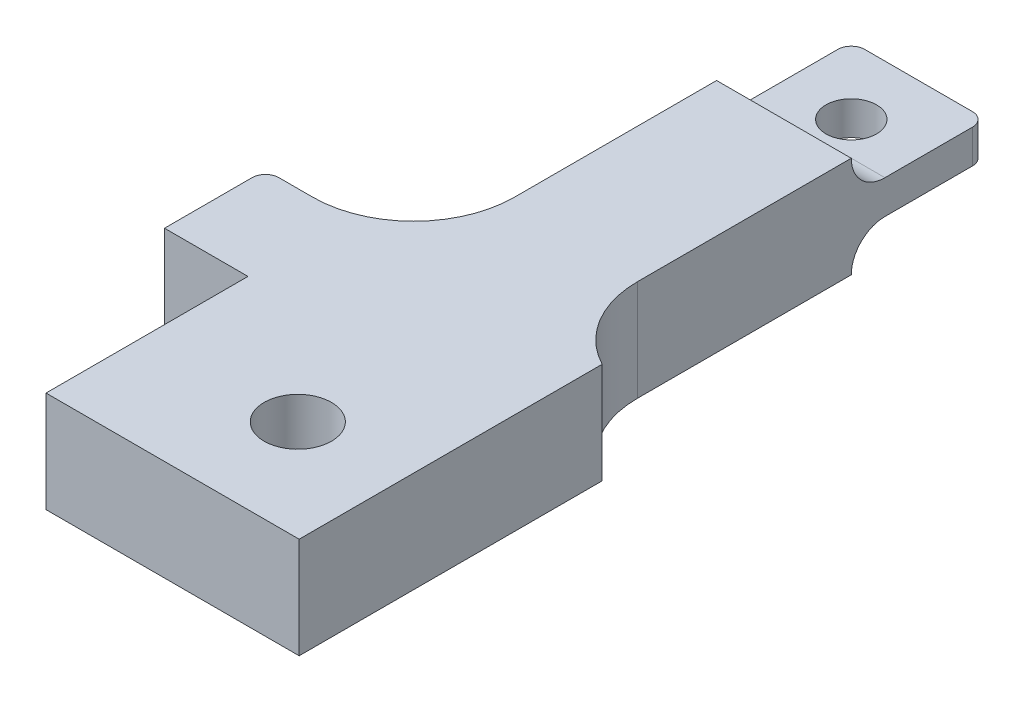
ISO-10303-21;
HEADER;
FILE_DESCRIPTION(('STEP AP214'),'2;1');
FILE_NAME('part.step','',(''),(''),'','','');
FILE_SCHEMA(('AUTOMOTIVE_DESIGN { 1 0 10303 214 1 1 1 1 }'));
ENDSEC;
DATA;
#1=APPLICATION_CONTEXT('core data for automotive mechanical design processes');
#2=APPLICATION_PROTOCOL_DEFINITION('international standard','automotive_design',2000,#1);
#3=PRODUCT_CONTEXT('',#1,'mechanical');
#4=PRODUCT('Part','Part','',(#3));
#5=PRODUCT_RELATED_PRODUCT_CATEGORY('part','',(#4));
#6=PRODUCT_DEFINITION_FORMATION('','',#4);
#7=PRODUCT_DEFINITION_CONTEXT('part definition',#1,'design');
#8=PRODUCT_DEFINITION('design','',#6,#7);
#9=PRODUCT_DEFINITION_SHAPE('','',#8);
#10=(LENGTH_UNIT() NAMED_UNIT(*) SI_UNIT(.MILLI.,.METRE.));
#11=(NAMED_UNIT(*) PLANE_ANGLE_UNIT() SI_UNIT($,.RADIAN.));
#12=(NAMED_UNIT(*) SI_UNIT($,.STERADIAN.) SOLID_ANGLE_UNIT());
#13=UNCERTAINTY_MEASURE_WITH_UNIT(LENGTH_MEASURE(1.E-05),#10,'distance_accuracy_value','');
#14=(GEOMETRIC_REPRESENTATION_CONTEXT(3) GLOBAL_UNCERTAINTY_ASSIGNED_CONTEXT((#13)) GLOBAL_UNIT_ASSIGNED_CONTEXT((#10,
#11,#12)) REPRESENTATION_CONTEXT('',''));
#15=CARTESIAN_POINT('',(0.,0.,0.));
#16=DIRECTION('',(0.,0.,1.));
#17=DIRECTION('',(1.,0.,0.));
#18=AXIS2_PLACEMENT_3D('',#15,#16,#17);
#19=CARTESIAN_POINT('',(6.096,9.525,-69.85));
#20=DIRECTION('',(0.,0.,1.));
#21=DIRECTION('',(1.,0.,0.));
#22=AXIS2_PLACEMENT_3D('',#19,#20,#21);
#23=PLANE('',#22);
#24=DIRECTION('',(0.,-1.,0.));
#25=VECTOR('',#24,1.);
#26=CARTESIAN_POINT('',(17.526,9.525,-69.85));
#27=LINE('',#26,#25);
#28=CARTESIAN_POINT('',(17.526,6.35,-69.85));
#29=VERTEX_POINT('',#28);
#30=CARTESIAN_POINT('',(17.526,3.175,-69.85));
#31=VERTEX_POINT('',#30);
#32=EDGE_CURVE('E292',#29,#31,#27,.T.);
#33=ORIENTED_EDGE('',*,*,#32,.T.);
#34=DIRECTION('',(1.,0.,0.));
#35=VECTOR('',#34,1.);
#36=CARTESIAN_POINT('',(6.096,3.175,-69.85));
#37=LINE('',#36,#35);
#38=CARTESIAN_POINT('',(7.366,3.175,-69.85));
#39=VERTEX_POINT('',#38);
#40=EDGE_CURVE('E192',#39,#31,#37,.T.);
#41=ORIENTED_EDGE('',*,*,#40,.F.);
#42=DIRECTION('',(0.,-1.,0.));
#43=VECTOR('',#42,1.);
#44=CARTESIAN_POINT('',(7.366,9.525,-69.85));
#45=LINE('',#44,#43);
#46=CARTESIAN_POINT('',(7.366,6.35,-69.85));
#47=VERTEX_POINT('',#46);
#48=EDGE_CURVE('E290',#39,#47,#45,.F.);
#49=ORIENTED_EDGE('',*,*,#48,.T.);
#50=DIRECTION('',(-1.,0.,0.));
#51=VECTOR('',#50,1.);
#52=CARTESIAN_POINT('',(6.096,6.35,-69.85));
#53=LINE('',#52,#51);
#54=EDGE_CURVE('E210',#29,#47,#53,.T.);
#55=ORIENTED_EDGE('',*,*,#54,.F.);
#56=EDGE_LOOP('',(#33,#41,#49,#55));
#57=FACE_BOUND('',#56,.T.);
#58=ADVANCED_FACE('F39',(#57),#23,.F.);
#59=CARTESIAN_POINT('',(12.446,9.525,-63.5));
#60=DIRECTION('',(0.,1.,0.));
#61=DIRECTION('',(0.,0.,1.));
#62=AXIS2_PLACEMENT_3D('',#59,#60,#61);
#63=CYLINDRICAL_SURFACE('',#62,2.38125);
#64=CARTESIAN_POINT('',(12.446,3.175,-63.5));
#65=DIRECTION('',(0.,1.,0.));
#66=DIRECTION('',(0.,0.,1.));
#67=AXIS2_PLACEMENT_3D('',#64,#65,#66);
#68=CIRCLE('',#67,2.38125);
#69=CARTESIAN_POINT('',(12.446,3.175,-61.11875));
#70=VERTEX_POINT('',#69);
#71=EDGE_CURVE('E202',#70,#70,#68,.F.);
#72=ORIENTED_EDGE('',*,*,#71,.T.);
#73=EDGE_LOOP('',(#72));
#74=FACE_BOUND('',#73,.T.);
#75=CARTESIAN_POINT('',(12.446,6.35,-63.5));
#76=DIRECTION('',(0.,1.,0.));
#77=DIRECTION('',(0.,0.,1.));
#78=AXIS2_PLACEMENT_3D('',#75,#76,#77);
#79=CIRCLE('',#78,2.38125);
#80=CARTESIAN_POINT('',(12.446,6.35,-61.11875));
#81=VERTEX_POINT('',#80);
#82=EDGE_CURVE('E217',#81,#81,#79,.F.);
#83=ORIENTED_EDGE('',*,*,#82,.F.);
#84=EDGE_LOOP('',(#83));
#85=FACE_BOUND('',#84,.T.);
#86=ADVANCED_FACE('F345',(#74,#85),#63,.F.);
#87=CARTESIAN_POINT('',(17.526,9.525,-68.58));
#88=DIRECTION('',(0.,-1.,0.));
#89=DIRECTION('',(0.,0.,-1.));
#90=AXIS2_PLACEMENT_3D('',#87,#88,#89);
#91=CYLINDRICAL_SURFACE('',#90,1.27);
#92=CARTESIAN_POINT('',(17.526,3.175,-68.58));
#93=DIRECTION('',(0.,1.,0.));
#94=DIRECTION('',(0.,0.,1.));
#95=AXIS2_PLACEMENT_3D('',#92,#93,#94);
#96=CIRCLE('',#95,1.27);
#97=CARTESIAN_POINT('',(18.796,3.175,-68.58));
#98=VERTEX_POINT('',#97);
#99=EDGE_CURVE('E200',#31,#98,#96,.F.);
#100=ORIENTED_EDGE('',*,*,#99,.F.);
#101=ORIENTED_EDGE('',*,*,#32,.F.);
#102=CARTESIAN_POINT('',(17.526,6.35,-68.58));
#103=DIRECTION('',(0.,1.,0.));
#104=DIRECTION('',(0.,0.,1.));
#105=AXIS2_PLACEMENT_3D('',#102,#103,#104);
#106=CIRCLE('',#105,1.27);
#107=CARTESIAN_POINT('',(18.796,6.35,-68.58));
#108=VERTEX_POINT('',#107);
#109=EDGE_CURVE('E213',#29,#108,#106,.F.);
#110=ORIENTED_EDGE('',*,*,#109,.T.);
#111=DIRECTION('',(0.,-1.,0.));
#112=VECTOR('',#111,1.);
#113=CARTESIAN_POINT('',(18.796,9.525,-68.58));
#114=LINE('',#113,#112);
#115=EDGE_CURVE('E297',#98,#108,#114,.F.);
#116=ORIENTED_EDGE('',*,*,#115,.F.);
#117=EDGE_LOOP('',(#100,#101,#110,#116));
#118=FACE_BOUND('',#117,.T.);
#119=ADVANCED_FACE('F343',(#118),#91,.T.);
#120=CARTESIAN_POINT('',(7.366,9.525,-68.58));
#121=DIRECTION('',(0.,-1.,0.));
#122=DIRECTION('',(0.,0.,-1.));
#123=AXIS2_PLACEMENT_3D('',#120,#121,#122);
#124=CYLINDRICAL_SURFACE('',#123,1.27);
#125=CARTESIAN_POINT('',(7.366,3.175,-68.58));
#126=DIRECTION('',(0.,1.,0.));
#127=DIRECTION('',(0.,0.,1.));
#128=AXIS2_PLACEMENT_3D('',#125,#126,#127);
#129=CIRCLE('',#128,1.27);
#130=CARTESIAN_POINT('',(6.096,3.175,-68.58));
#131=VERTEX_POINT('',#130);
#132=EDGE_CURVE('E198',#131,#39,#129,.F.);
#133=ORIENTED_EDGE('',*,*,#132,.F.);
#134=DIRECTION('',(0.,-1.,0.));
#135=VECTOR('',#134,1.);
#136=CARTESIAN_POINT('',(6.096,9.525,-68.58));
#137=LINE('',#136,#135);
#138=CARTESIAN_POINT('',(6.096,6.35,-68.58));
#139=VERTEX_POINT('',#138);
#140=EDGE_CURVE('E302',#139,#131,#137,.T.);
#141=ORIENTED_EDGE('',*,*,#140,.F.);
#142=CARTESIAN_POINT('',(7.366,6.35,-68.58));
#143=DIRECTION('',(0.,1.,0.));
#144=DIRECTION('',(0.,0.,1.));
#145=AXIS2_PLACEMENT_3D('',#142,#143,#144);
#146=CIRCLE('',#145,1.27);
#147=EDGE_CURVE('E309',#139,#47,#146,.F.);
#148=ORIENTED_EDGE('',*,*,#147,.T.);
#149=ORIENTED_EDGE('',*,*,#48,.F.);
#150=EDGE_LOOP('',(#133,#141,#148,#149));
#151=FACE_BOUND('',#150,.T.);
#152=ADVANCED_FACE('F329',(#151),#124,.T.);
#153=CARTESIAN_POINT('',(23.876,9.525,0.));
#154=DIRECTION('',(0.,0.,-1.));
#155=DIRECTION('',(-1.,0.,0.));
#156=AXIS2_PLACEMENT_3D('',#153,#154,#155);
#157=PLANE('',#156);
#158=DIRECTION('',(1.,0.,0.));
#159=VECTOR('',#158,1.);
#160=CARTESIAN_POINT('',(23.876,0.,0.));
#161=LINE('',#160,#159);
#162=CARTESIAN_POINT('',(0.,0.,0.));
#163=VERTEX_POINT('',#162);
#164=CARTESIAN_POINT('',(23.876,0.,0.));
#165=VERTEX_POINT('',#164);
#166=EDGE_CURVE('E226',#163,#165,#161,.T.);
#167=ORIENTED_EDGE('',*,*,#166,.T.);
#168=DIRECTION('',(0.,-1.,0.));
#169=VECTOR('',#168,1.);
#170=CARTESIAN_POINT('',(23.876,9.525,0.));
#171=LINE('',#170,#169);
#172=CARTESIAN_POINT('',(23.876,9.525,0.));
#173=VERTEX_POINT('',#172);
#174=EDGE_CURVE('E272',#173,#165,#171,.T.);
#175=ORIENTED_EDGE('',*,*,#174,.F.);
#176=DIRECTION('',(1.,0.,0.));
#177=VECTOR('',#176,1.);
#178=CARTESIAN_POINT('',(23.876,9.525,0.));
#179=LINE('',#178,#177);
#180=CARTESIAN_POINT('',(0.,9.525,0.));
#181=VERTEX_POINT('',#180);
#182=EDGE_CURVE('E227',#181,#173,#179,.T.);
#183=ORIENTED_EDGE('',*,*,#182,.F.);
#184=DIRECTION('',(0.,-1.,0.));
#185=VECTOR('',#184,1.);
#186=CARTESIAN_POINT('',(0.,9.525,0.));
#187=LINE('',#186,#185);
#188=EDGE_CURVE('E247',#181,#163,#187,.T.);
#189=ORIENTED_EDGE('',*,*,#188,.T.);
#190=EDGE_LOOP('',(#167,#175,#183,#189));
#191=FACE_BOUND('',#190,.T.);
#192=ADVANCED_FACE('F351',(#191),#157,.F.);
#193=CARTESIAN_POINT('',(23.876,9.525,0.));
#194=DIRECTION('',(-1.,0.,0.));
#195=DIRECTION('',(0.,0.,1.));
#196=AXIS2_PLACEMENT_3D('',#193,#194,#195);
#197=PLANE('',#196);
#198=DIRECTION('',(0.,0.,-1.));
#199=VECTOR('',#198,1.);
#200=CARTESIAN_POINT('',(23.876,0.,0.));
#201=LINE('',#200,#199);
#202=CARTESIAN_POINT('',(23.876,0.,-28.575));
#203=VERTEX_POINT('',#202);
#204=EDGE_CURVE('E250',#165,#203,#201,.T.);
#205=ORIENTED_EDGE('',*,*,#204,.T.);
#206=DIRECTION('',(0.,-1.,0.));
#207=VECTOR('',#206,1.);
#208=CARTESIAN_POINT('',(23.876,9.525,-28.575));
#209=LINE('',#208,#207);
#210=CARTESIAN_POINT('',(23.876,9.525,-28.575));
#211=VERTEX_POINT('',#210);
#212=EDGE_CURVE('E269',#211,#203,#209,.T.);
#213=ORIENTED_EDGE('',*,*,#212,.F.);
#214=DIRECTION('',(0.,0.,-1.));
#215=VECTOR('',#214,1.);
#216=CARTESIAN_POINT('',(23.876,9.525,0.));
#217=LINE('',#216,#215);
#218=EDGE_CURVE('E230',#173,#211,#217,.T.);
#219=ORIENTED_EDGE('',*,*,#218,.F.);
#220=ORIENTED_EDGE('',*,*,#174,.T.);
#221=EDGE_LOOP('',(#205,#213,#219,#220));
#222=FACE_BOUND('',#221,.T.);
#223=ADVANCED_FACE('F366',(#222),#197,.F.);
#224=CARTESIAN_POINT('',(18.796,9.525,-28.575));
#225=DIRECTION('',(-1.,0.,0.));
#226=DIRECTION('',(0.,0.,1.));
#227=AXIS2_PLACEMENT_3D('',#224,#225,#226);
#228=PLANE('',#227);
#229=DIRECTION('',(0.,0.,-1.));
#230=VECTOR('',#229,1.);
#231=CARTESIAN_POINT('',(18.796,0.,-28.575));
#232=LINE('',#231,#230);
#233=CARTESIAN_POINT('',(18.796,0.,-36.9992269675027));
#234=VERTEX_POINT('',#233);
#235=CARTESIAN_POINT('',(18.796,0.,-57.15));
#236=VERTEX_POINT('',#235);
#237=EDGE_CURVE('E187',#234,#236,#232,.T.);
#238=ORIENTED_EDGE('',*,*,#237,.T.);
#239=CARTESIAN_POINT('',(18.796,0.,-60.325));
#240=DIRECTION('',(-1.,0.,0.));
#241=DIRECTION('',(0.,0.,1.));
#242=AXIS2_PLACEMENT_3D('',#239,#240,#241);
#243=CIRCLE('',#242,3.175);
#244=CARTESIAN_POINT('',(18.796,3.175,-60.325));
#245=VERTEX_POINT('',#244);
#246=EDGE_CURVE('E174',#236,#245,#243,.T.);
#247=ORIENTED_EDGE('',*,*,#246,.T.);
#248=DIRECTION('',(0.,0.,1.));
#249=VECTOR('',#248,1.);
#250=CARTESIAN_POINT('',(18.796,3.175,-69.85));
#251=LINE('',#250,#249);
#252=EDGE_CURVE('E196',#98,#245,#251,.T.);
#253=ORIENTED_EDGE('',*,*,#252,.F.);
#254=ORIENTED_EDGE('',*,*,#115,.T.);
#255=DIRECTION('',(0.,0.,-1.));
#256=VECTOR('',#255,1.);
#257=CARTESIAN_POINT('',(18.796,6.35,-69.85));
#258=LINE('',#257,#256);
#259=CARTESIAN_POINT('',(18.796,6.35,-60.325));
#260=VERTEX_POINT('',#259);
#261=EDGE_CURVE('E208',#260,#108,#258,.T.);
#262=ORIENTED_EDGE('',*,*,#261,.F.);
#263=CARTESIAN_POINT('',(18.796,9.525,-60.325));
#264=DIRECTION('',(-1.,0.,0.));
#265=DIRECTION('',(0.,0.,1.));
#266=AXIS2_PLACEMENT_3D('',#263,#264,#265);
#267=CIRCLE('',#266,3.175);
#268=CARTESIAN_POINT('',(18.796,9.525,-57.15));
#269=VERTEX_POINT('',#268);
#270=EDGE_CURVE('E47',#260,#269,#267,.T.);
#271=ORIENTED_EDGE('',*,*,#270,.T.);
#272=DIRECTION('',(0.,0.,-1.));
#273=VECTOR('',#272,1.);
#274=CARTESIAN_POINT('',(18.796,9.525,-28.575));
#275=LINE('',#274,#273);
#276=CARTESIAN_POINT('',(18.796,9.525,-36.9992269675027));
#277=VERTEX_POINT('',#276);
#278=EDGE_CURVE('E233',#277,#269,#275,.T.);
#279=ORIENTED_EDGE('',*,*,#278,.F.);
#280=DIRECTION('',(0.,-1.,0.));
#281=VECTOR('',#280,1.);
#282=CARTESIAN_POINT('',(18.796,9.525,-36.9992269675027));
#283=LINE('',#282,#281);
#284=EDGE_CURVE('E275',#277,#234,#283,.T.);
#285=ORIENTED_EDGE('',*,*,#284,.T.);
#286=EDGE_LOOP('',(#238,#247,#253,#254,#262,#271,#279,#285));
#287=FACE_BOUND('',#286,.T.);
#288=ADVANCED_FACE('F318',(#287),#228,.F.);
#289=CARTESIAN_POINT('',(6.096,9.525,-28.575));
#290=DIRECTION('',(1.,0.,0.));
#291=DIRECTION('',(0.,0.,-1.));
#292=AXIS2_PLACEMENT_3D('',#289,#290,#291);
#293=PLANE('',#292);
#294=DIRECTION('',(0.,0.,-1.));
#295=VECTOR('',#294,1.);
#296=CARTESIAN_POINT('',(6.096,3.175,-69.85));
#297=LINE('',#296,#295);
#298=CARTESIAN_POINT('',(6.096,3.175,-60.325));
#299=VERTEX_POINT('',#298);
#300=EDGE_CURVE('E169',#299,#131,#297,.T.);
#301=ORIENTED_EDGE('',*,*,#300,.F.);
#302=CARTESIAN_POINT('',(6.096,0.,-60.325));
#303=DIRECTION('',(1.,0.,0.));
#304=DIRECTION('',(0.,0.,-1.));
#305=AXIS2_PLACEMENT_3D('',#302,#303,#304);
#306=CIRCLE('',#305,3.175);
#307=CARTESIAN_POINT('',(6.096,0.,-57.15));
#308=VERTEX_POINT('',#307);
#309=EDGE_CURVE('E162',#299,#308,#306,.T.);
#310=ORIENTED_EDGE('',*,*,#309,.T.);
#311=DIRECTION('',(0.,0.,1.));
#312=VECTOR('',#311,1.);
#313=CARTESIAN_POINT('',(6.096,0.,-28.575));
#314=LINE('',#313,#312);
#315=CARTESIAN_POINT('',(6.096,0.,-38.1));
#316=VERTEX_POINT('',#315);
#317=EDGE_CURVE('E166',#308,#316,#314,.T.);
#318=ORIENTED_EDGE('',*,*,#317,.T.);
#319=DIRECTION('',(0.,-1.,0.));
#320=VECTOR('',#319,1.);
#321=CARTESIAN_POINT('',(6.096,9.525,-38.1));
#322=LINE('',#321,#320);
#323=CARTESIAN_POINT('',(6.096,9.525,-38.1));
#324=VERTEX_POINT('',#323);
#325=EDGE_CURVE('E281',#316,#324,#322,.F.);
#326=ORIENTED_EDGE('',*,*,#325,.T.);
#327=DIRECTION('',(0.,0.,1.));
#328=VECTOR('',#327,1.);
#329=CARTESIAN_POINT('',(6.096,9.525,-28.575));
#330=LINE('',#329,#328);
#331=CARTESIAN_POINT('',(6.096,9.525,-57.15));
#332=VERTEX_POINT('',#331);
#333=EDGE_CURVE('E236',#332,#324,#330,.T.);
#334=ORIENTED_EDGE('',*,*,#333,.F.);
#335=CARTESIAN_POINT('',(6.096,9.525,-60.325));
#336=DIRECTION('',(1.,0.,0.));
#337=DIRECTION('',(0.,0.,-1.));
#338=AXIS2_PLACEMENT_3D('',#335,#336,#337);
#339=CIRCLE('',#338,3.175);
#340=CARTESIAN_POINT('',(6.096,6.35,-60.325));
#341=VERTEX_POINT('',#340);
#342=EDGE_CURVE('E11',#332,#341,#339,.T.);
#343=ORIENTED_EDGE('',*,*,#342,.T.);
#344=DIRECTION('',(0.,0.,1.));
#345=VECTOR('',#344,1.);
#346=CARTESIAN_POINT('',(6.096,6.35,-69.85));
#347=LINE('',#346,#345);
#348=EDGE_CURVE('E206',#139,#341,#347,.T.);
#349=ORIENTED_EDGE('',*,*,#348,.F.);
#350=ORIENTED_EDGE('',*,*,#140,.T.);
#351=EDGE_LOOP('',(#301,#310,#318,#326,#334,#343,#349,#350));
#352=FACE_BOUND('',#351,.T.);
#353=ADVANCED_FACE('F164',(#352),#293,.F.);
#354=CARTESIAN_POINT('',(-7.874,9.525,-28.575));
#355=DIRECTION('',(0.,0.,1.));
#356=DIRECTION('',(1.,0.,0.));
#357=AXIS2_PLACEMENT_3D('',#354,#355,#356);
#358=PLANE('',#357);
#359=DIRECTION('',(-1.,0.,0.));
#360=VECTOR('',#359,1.);
#361=CARTESIAN_POINT('',(-7.874,0.,-28.575));
#362=LINE('',#361,#360);
#363=CARTESIAN_POINT('',(-3.42900000000001,0.,-28.575));
#364=VERTEX_POINT('',#363);
#365=CARTESIAN_POINT('',(-6.604,0.,-28.575));
#366=VERTEX_POINT('',#365);
#367=EDGE_CURVE('E186',#364,#366,#362,.T.);
#368=ORIENTED_EDGE('',*,*,#367,.T.);
#369=DIRECTION('',(0.,-1.,0.));
#370=VECTOR('',#369,1.);
#371=CARTESIAN_POINT('',(-6.604,9.525,-28.575));
#372=LINE('',#371,#370);
#373=CARTESIAN_POINT('',(-6.604,9.525,-28.575));
#374=VERTEX_POINT('',#373);
#375=EDGE_CURVE('E307',#366,#374,#372,.F.);
#376=ORIENTED_EDGE('',*,*,#375,.T.);
#377=DIRECTION('',(-1.,0.,0.));
#378=VECTOR('',#377,1.);
#379=CARTESIAN_POINT('',(-7.874,9.525,-28.575));
#380=LINE('',#379,#378);
#381=CARTESIAN_POINT('',(-3.42900000000001,9.525,-28.575));
#382=VERTEX_POINT('',#381);
#383=EDGE_CURVE('E238',#382,#374,#380,.T.);
#384=ORIENTED_EDGE('',*,*,#383,.F.);
#385=DIRECTION('',(0.,-1.,0.));
#386=VECTOR('',#385,1.);
#387=CARTESIAN_POINT('',(-3.42900000000001,0.,-28.575));
#388=LINE('',#387,#386);
#389=EDGE_CURVE('E278',#382,#364,#388,.T.);
#390=ORIENTED_EDGE('',*,*,#389,.T.);
#391=EDGE_LOOP('',(#368,#376,#384,#390));
#392=FACE_BOUND('',#391,.T.);
#393=ADVANCED_FACE('F391',(#392),#358,.F.);
#394=CARTESIAN_POINT('',(-7.874,9.525,-19.05));
#395=DIRECTION('',(1.,0.,0.));
#396=DIRECTION('',(0.,0.,-1.));
#397=AXIS2_PLACEMENT_3D('',#394,#395,#396);
#398=PLANE('',#397);
#399=DIRECTION('',(0.,0.,1.));
#400=VECTOR('',#399,1.);
#401=CARTESIAN_POINT('',(-7.874,9.525,-19.05));
#402=LINE('',#401,#400);
#403=CARTESIAN_POINT('',(-7.874,9.525,-27.305));
#404=VERTEX_POINT('',#403);
#405=CARTESIAN_POINT('',(-7.874,9.525,-19.05));
#406=VERTEX_POINT('',#405);
#407=EDGE_CURVE('E241',#404,#406,#402,.T.);
#408=ORIENTED_EDGE('',*,*,#407,.F.);
#409=DIRECTION('',(0.,-1.,0.));
#410=VECTOR('',#409,1.);
#411=CARTESIAN_POINT('',(-7.874,9.525,-27.305));
#412=LINE('',#411,#410);
#413=CARTESIAN_POINT('',(-7.874,0.,-27.305));
#414=VERTEX_POINT('',#413);
#415=EDGE_CURVE('E304',#404,#414,#412,.T.);
#416=ORIENTED_EDGE('',*,*,#415,.T.);
#417=DIRECTION('',(0.,0.,1.));
#418=VECTOR('',#417,1.);
#419=CARTESIAN_POINT('',(-7.874,0.,-19.05));
#420=LINE('',#419,#418);
#421=CARTESIAN_POINT('',(-7.874,0.,-19.05));
#422=VERTEX_POINT('',#421);
#423=EDGE_CURVE('E256',#414,#422,#420,.T.);
#424=ORIENTED_EDGE('',*,*,#423,.T.);
#425=DIRECTION('',(0.,-1.,0.));
#426=VECTOR('',#425,1.);
#427=CARTESIAN_POINT('',(-7.874,9.525,-19.05));
#428=LINE('',#427,#426);
#429=EDGE_CURVE('E266',#406,#422,#428,.T.);
#430=ORIENTED_EDGE('',*,*,#429,.F.);
#431=EDGE_LOOP('',(#408,#416,#424,#430));
#432=FACE_BOUND('',#431,.T.);
#433=ADVANCED_FACE('F397',(#432),#398,.F.);
#434=CARTESIAN_POINT('',(0.,9.525,-19.05));
#435=DIRECTION('',(0.,0.,-1.));
#436=DIRECTION('',(-1.,0.,0.));
#437=AXIS2_PLACEMENT_3D('',#434,#435,#436);
#438=PLANE('',#437);
#439=DIRECTION('',(1.,0.,0.));
#440=VECTOR('',#439,1.);
#441=CARTESIAN_POINT('',(0.,0.,-19.05));
#442=LINE('',#441,#440);
#443=CARTESIAN_POINT('',(0.,0.,-19.05));
#444=VERTEX_POINT('',#443);
#445=EDGE_CURVE('E258',#422,#444,#442,.T.);
#446=ORIENTED_EDGE('',*,*,#445,.T.);
#447=DIRECTION('',(0.,-1.,0.));
#448=VECTOR('',#447,1.);
#449=CARTESIAN_POINT('',(0.,9.525,-19.05));
#450=LINE('',#449,#448);
#451=CARTESIAN_POINT('',(0.,9.525,-19.05));
#452=VERTEX_POINT('',#451);
#453=EDGE_CURVE('E263',#452,#444,#450,.T.);
#454=ORIENTED_EDGE('',*,*,#453,.F.);
#455=DIRECTION('',(1.,0.,0.));
#456=VECTOR('',#455,1.);
#457=CARTESIAN_POINT('',(0.,9.525,-19.05));
#458=LINE('',#457,#456);
#459=EDGE_CURVE('E243',#406,#452,#458,.T.);
#460=ORIENTED_EDGE('',*,*,#459,.F.);
#461=ORIENTED_EDGE('',*,*,#429,.T.);
#462=EDGE_LOOP('',(#446,#454,#460,#461));
#463=FACE_BOUND('',#462,.T.);
#464=ADVANCED_FACE('F403',(#463),#438,.F.);
#465=CARTESIAN_POINT('',(0.,9.525,0.));
#466=DIRECTION('',(1.,0.,0.));
#467=DIRECTION('',(0.,0.,-1.));
#468=AXIS2_PLACEMENT_3D('',#465,#466,#467);
#469=PLANE('',#468);
#470=DIRECTION('',(0.,0.,1.));
#471=VECTOR('',#470,1.);
#472=CARTESIAN_POINT('',(0.,0.,0.));
#473=LINE('',#472,#471);
#474=EDGE_CURVE('E231',#444,#163,#473,.T.);
#475=ORIENTED_EDGE('',*,*,#474,.T.);
#476=ORIENTED_EDGE('',*,*,#188,.F.);
#477=DIRECTION('',(0.,0.,1.));
#478=VECTOR('',#477,1.);
#479=CARTESIAN_POINT('',(0.,9.525,0.));
#480=LINE('',#479,#478);
#481=EDGE_CURVE('E245',#452,#181,#480,.T.);
#482=ORIENTED_EDGE('',*,*,#481,.F.);
#483=ORIENTED_EDGE('',*,*,#453,.T.);
#484=EDGE_LOOP('',(#475,#476,#482,#483));
#485=FACE_BOUND('',#484,.T.);
#486=ADVANCED_FACE('F409',(#485),#469,.F.);
#487=CARTESIAN_POINT('',(0.,9.525,0.));
#488=DIRECTION('',(0.,-1.,0.));
#489=DIRECTION('',(0.,0.,-1.));
#490=AXIS2_PLACEMENT_3D('',#487,#488,#489);
#491=PLANE('',#490);
#492=CARTESIAN_POINT('',(14.224,9.525,-9.525));
#493=DIRECTION('',(0.,1.,0.));
#494=DIRECTION('',(0.,0.,1.));
#495=AXIS2_PLACEMENT_3D('',#492,#493,#494);
#496=CIRCLE('',#495,3.175);
#497=CARTESIAN_POINT('',(14.224,9.525,-6.35));
#498=VERTEX_POINT('',#497);
#499=EDGE_CURVE('E220',#498,#498,#496,.T.);
#500=ORIENTED_EDGE('',*,*,#499,.F.);
#501=EDGE_LOOP('',(#500));
#502=FACE_BOUND('',#501,.T.);
#503=ORIENTED_EDGE('',*,*,#278,.T.);
#504=DIRECTION('',(1.,0.,0.));
#505=VECTOR('',#504,1.);
#506=CARTESIAN_POINT('',(6.096,9.525,-57.15));
#507=LINE('',#506,#505);
#508=EDGE_CURVE('E205',#332,#269,#507,.T.);
#509=ORIENTED_EDGE('',*,*,#508,.F.);
#510=ORIENTED_EDGE('',*,*,#333,.T.);
#511=CARTESIAN_POINT('',(-3.429,9.525,-38.1));
#512=DIRECTION('',(0.,-1.,0.));
#513=DIRECTION('',(0.,0.,-1.));
#514=AXIS2_PLACEMENT_3D('',#511,#512,#513);
#515=CIRCLE('',#514,9.525);
#516=EDGE_CURVE('E288',#324,#382,#515,.T.);
#517=ORIENTED_EDGE('',*,*,#516,.T.);
#518=ORIENTED_EDGE('',*,*,#383,.T.);
#519=CARTESIAN_POINT('',(-6.604,9.525,-27.305));
#520=DIRECTION('',(0.,-1.,0.));
#521=DIRECTION('',(0.,0.,-1.));
#522=AXIS2_PLACEMENT_3D('',#519,#520,#521);
#523=CIRCLE('',#522,1.27);
#524=EDGE_CURVE('E300',#374,#404,#523,.F.);
#525=ORIENTED_EDGE('',*,*,#524,.T.);
#526=ORIENTED_EDGE('',*,*,#407,.T.);
#527=ORIENTED_EDGE('',*,*,#459,.T.);
#528=ORIENTED_EDGE('',*,*,#481,.T.);
#529=ORIENTED_EDGE('',*,*,#182,.T.);
#530=ORIENTED_EDGE('',*,*,#218,.T.);
#531=CARTESIAN_POINT('',(28.321,9.525,-36.9992269675027));
#532=DIRECTION('',(0.,-1.,0.));
#533=DIRECTION('',(0.,0.,-1.));
#534=AXIS2_PLACEMENT_3D('',#531,#532,#533);
#535=CIRCLE('',#534,9.525);
#536=EDGE_CURVE('E285',#211,#277,#535,.T.);
#537=ORIENTED_EDGE('',*,*,#536,.T.);
#538=EDGE_LOOP('',(#503,#509,#510,#517,#518,#525,#526,#527,#528,#529,#530,#537));
#539=FACE_BOUND('',#538,.T.);
#540=ADVANCED_FACE('F321',(#502,#539),#491,.F.);
#541=CARTESIAN_POINT('',(0.,0.,0.));
#542=DIRECTION('',(0.,-1.,0.));
#543=DIRECTION('',(0.,0.,-1.));
#544=AXIS2_PLACEMENT_3D('',#541,#542,#543);
#545=PLANE('',#544);
#546=DIRECTION('',(-1.,0.,0.));
#547=VECTOR('',#546,1.);
#548=CARTESIAN_POINT('',(6.096,0.,-57.15));
#549=LINE('',#548,#547);
#550=EDGE_CURVE('E181',#236,#308,#549,.T.);
#551=ORIENTED_EDGE('',*,*,#550,.F.);
#552=ORIENTED_EDGE('',*,*,#237,.F.);
#553=CARTESIAN_POINT('',(28.321,0.,-36.9992269675027));
#554=DIRECTION('',(0.,-1.,0.));
#555=DIRECTION('',(0.,0.,-1.));
#556=AXIS2_PLACEMENT_3D('',#553,#554,#555);
#557=CIRCLE('',#556,9.525);
#558=EDGE_CURVE('E283',#234,#203,#557,.F.);
#559=ORIENTED_EDGE('',*,*,#558,.T.);
#560=ORIENTED_EDGE('',*,*,#204,.F.);
#561=ORIENTED_EDGE('',*,*,#166,.F.);
#562=ORIENTED_EDGE('',*,*,#474,.F.);
#563=ORIENTED_EDGE('',*,*,#445,.F.);
#564=ORIENTED_EDGE('',*,*,#423,.F.);
#565=CARTESIAN_POINT('',(-6.604,0.,-27.305));
#566=DIRECTION('',(0.,-1.,0.));
#567=DIRECTION('',(0.,0.,-1.));
#568=AXIS2_PLACEMENT_3D('',#565,#566,#567);
#569=CIRCLE('',#568,1.27);
#570=EDGE_CURVE('E295',#414,#366,#569,.T.);
#571=ORIENTED_EDGE('',*,*,#570,.T.);
#572=ORIENTED_EDGE('',*,*,#367,.F.);
#573=CARTESIAN_POINT('',(-3.429,0.,-38.1));
#574=DIRECTION('',(0.,-1.,0.));
#575=DIRECTION('',(0.,0.,-1.));
#576=AXIS2_PLACEMENT_3D('',#573,#574,#575);
#577=CIRCLE('',#576,9.525);
#578=EDGE_CURVE('E184',#364,#316,#577,.F.);
#579=ORIENTED_EDGE('',*,*,#578,.T.);
#580=ORIENTED_EDGE('',*,*,#317,.F.);
#581=EDGE_LOOP('',(#551,#552,#559,#560,#561,#562,#563,#564,#571,#572,#579,#580));
#582=FACE_BOUND('',#581,.T.);
#583=CARTESIAN_POINT('',(14.224,0.,-9.525));
#584=DIRECTION('',(0.,1.,0.));
#585=DIRECTION('',(0.,0.,1.));
#586=AXIS2_PLACEMENT_3D('',#583,#584,#585);
#587=CIRCLE('',#586,3.175);
#588=CARTESIAN_POINT('',(14.224,0.,-6.35));
#589=VERTEX_POINT('',#588);
#590=EDGE_CURVE('E223',#589,#589,#587,.T.);
#591=ORIENTED_EDGE('',*,*,#590,.T.);
#592=EDGE_LOOP('',(#591));
#593=FACE_BOUND('',#592,.T.);
#594=ADVANCED_FACE('F178',(#582,#593),#545,.T.);
#595=CARTESIAN_POINT('',(14.224,9.525,-9.525));
#596=DIRECTION('',(0.,1.,0.));
#597=DIRECTION('',(0.,0.,1.));
#598=AXIS2_PLACEMENT_3D('',#595,#596,#597);
#599=CYLINDRICAL_SURFACE('',#598,3.175);
#600=ORIENTED_EDGE('',*,*,#590,.F.);
#601=EDGE_LOOP('',(#600));
#602=FACE_BOUND('',#601,.T.);
#603=ORIENTED_EDGE('',*,*,#499,.T.);
#604=EDGE_LOOP('',(#603));
#605=FACE_BOUND('',#604,.T.);
#606=ADVANCED_FACE('F376',(#602,#605),#599,.F.);
#607=CARTESIAN_POINT('',(28.321,9.525,-36.9992269675027));
#608=DIRECTION('',(0.,-1.,0.));
#609=DIRECTION('',(0.,0.,-1.));
#610=AXIS2_PLACEMENT_3D('',#607,#608,#609);
#611=CYLINDRICAL_SURFACE('',#610,9.525);
#612=ORIENTED_EDGE('',*,*,#536,.F.);
#613=ORIENTED_EDGE('',*,*,#212,.T.);
#614=ORIENTED_EDGE('',*,*,#558,.F.);
#615=ORIENTED_EDGE('',*,*,#284,.F.);
#616=EDGE_LOOP('',(#612,#613,#614,#615));
#617=FACE_BOUND('',#616,.T.);
#618=ADVANCED_FACE('F373',(#617),#611,.F.);
#619=CARTESIAN_POINT('',(-3.429,9.525,-38.1));
#620=DIRECTION('',(0.,1.,0.));
#621=DIRECTION('',(0.,0.,1.));
#622=AXIS2_PLACEMENT_3D('',#619,#620,#621);
#623=CYLINDRICAL_SURFACE('',#622,9.525);
#624=ORIENTED_EDGE('',*,*,#516,.F.);
#625=ORIENTED_EDGE('',*,*,#325,.F.);
#626=ORIENTED_EDGE('',*,*,#578,.F.);
#627=ORIENTED_EDGE('',*,*,#389,.F.);
#628=EDGE_LOOP('',(#624,#625,#626,#627));
#629=FACE_BOUND('',#628,.T.);
#630=ADVANCED_FACE('F375',(#629),#623,.F.);
#631=CARTESIAN_POINT('',(-6.604,9.525,-27.305));
#632=DIRECTION('',(0.,-1.,0.));
#633=DIRECTION('',(0.,0.,-1.));
#634=AXIS2_PLACEMENT_3D('',#631,#632,#633);
#635=CYLINDRICAL_SURFACE('',#634,1.27);
#636=ORIENTED_EDGE('',*,*,#524,.F.);
#637=ORIENTED_EDGE('',*,*,#375,.F.);
#638=ORIENTED_EDGE('',*,*,#570,.F.);
#639=ORIENTED_EDGE('',*,*,#415,.F.);
#640=EDGE_LOOP('',(#636,#637,#638,#639));
#641=FACE_BOUND('',#640,.T.);
#642=ADVANCED_FACE('F379',(#641),#635,.T.);
#643=CARTESIAN_POINT('',(0.,6.35,0.));
#644=DIRECTION('',(0.,1.,0.));
#645=DIRECTION('',(0.,0.,1.));
#646=AXIS2_PLACEMENT_3D('',#643,#644,#645);
#647=PLANE('',#646);
#648=ORIENTED_EDGE('',*,*,#348,.T.);
#649=DIRECTION('',(1.,0.,0.));
#650=VECTOR('',#649,1.);
#651=CARTESIAN_POINT('',(0.,6.35,-60.325));
#652=LINE('',#651,#650);
#653=EDGE_CURVE('E175',#341,#260,#652,.T.);
#654=ORIENTED_EDGE('',*,*,#653,.T.);
#655=ORIENTED_EDGE('',*,*,#261,.T.);
#656=ORIENTED_EDGE('',*,*,#109,.F.);
#657=ORIENTED_EDGE('',*,*,#54,.T.);
#658=ORIENTED_EDGE('',*,*,#147,.F.);
#659=EDGE_LOOP('',(#648,#654,#655,#656,#657,#658));
#660=FACE_BOUND('',#659,.T.);
#661=ORIENTED_EDGE('',*,*,#82,.T.);
#662=EDGE_LOOP('',(#661));
#663=FACE_BOUND('',#662,.T.);
#664=ADVANCED_FACE('F324',(#660,#663),#647,.T.);
#665=CARTESIAN_POINT('',(0.,3.175,0.));
#666=DIRECTION('',(0.,1.,0.));
#667=DIRECTION('',(0.,0.,1.));
#668=AXIS2_PLACEMENT_3D('',#665,#666,#667);
#669=PLANE('',#668);
#670=ORIENTED_EDGE('',*,*,#252,.T.);
#671=DIRECTION('',(-1.,0.,0.));
#672=VECTOR('',#671,1.);
#673=CARTESIAN_POINT('',(6.096,3.175,-60.325));
#674=LINE('',#673,#672);
#675=EDGE_CURVE('E312',#245,#299,#674,.T.);
#676=ORIENTED_EDGE('',*,*,#675,.T.);
#677=ORIENTED_EDGE('',*,*,#300,.T.);
#678=ORIENTED_EDGE('',*,*,#132,.T.);
#679=ORIENTED_EDGE('',*,*,#40,.T.);
#680=ORIENTED_EDGE('',*,*,#99,.T.);
#681=EDGE_LOOP('',(#670,#676,#677,#678,#679,#680));
#682=FACE_BOUND('',#681,.T.);
#683=ORIENTED_EDGE('',*,*,#71,.F.);
#684=EDGE_LOOP('',(#683));
#685=FACE_BOUND('',#684,.T.);
#686=ADVANCED_FACE('F334',(#682,#685),#669,.F.);
#687=CARTESIAN_POINT('',(0.,0.,-60.325));
#688=DIRECTION('',(1.,0.,0.));
#689=DIRECTION('',(0.,0.,-1.));
#690=AXIS2_PLACEMENT_3D('',#687,#688,#689);
#691=CYLINDRICAL_SURFACE('',#690,3.175);
#692=ORIENTED_EDGE('',*,*,#246,.F.);
#693=ORIENTED_EDGE('',*,*,#550,.T.);
#694=ORIENTED_EDGE('',*,*,#309,.F.);
#695=ORIENTED_EDGE('',*,*,#675,.F.);
#696=EDGE_LOOP('',(#692,#693,#694,#695));
#697=FACE_BOUND('',#696,.T.);
#698=ADVANCED_FACE('F190',(#697),#691,.F.);
#699=CARTESIAN_POINT('',(0.,9.525,-60.325));
#700=DIRECTION('',(1.,0.,0.));
#701=DIRECTION('',(0.,0.,-1.));
#702=AXIS2_PLACEMENT_3D('',#699,#700,#701);
#703=CYLINDRICAL_SURFACE('',#702,3.175);
#704=ORIENTED_EDGE('',*,*,#342,.F.);
#705=ORIENTED_EDGE('',*,*,#508,.T.);
#706=ORIENTED_EDGE('',*,*,#270,.F.);
#707=ORIENTED_EDGE('',*,*,#653,.F.);
#708=EDGE_LOOP('',(#704,#705,#706,#707));
#709=FACE_BOUND('',#708,.T.);
#710=ADVANCED_FACE('F41',(#709),#703,.F.);
#711=CLOSED_SHELL('',(#58,#86,#119,#152,#192,#223,#288,#353,#393,#433,#464,#486,#540,#594,#606,
#618,#630,#642,#664,#686,#698,#710));
#712=MANIFOLD_SOLID_BREP('B2',#711);
#713=ADVANCED_BREP_SHAPE_REPRESENTATION('',(#18,#712),#14);
#714=SHAPE_DEFINITION_REPRESENTATION(#9,#713);
ENDSEC;
END-ISO-10303-21;
